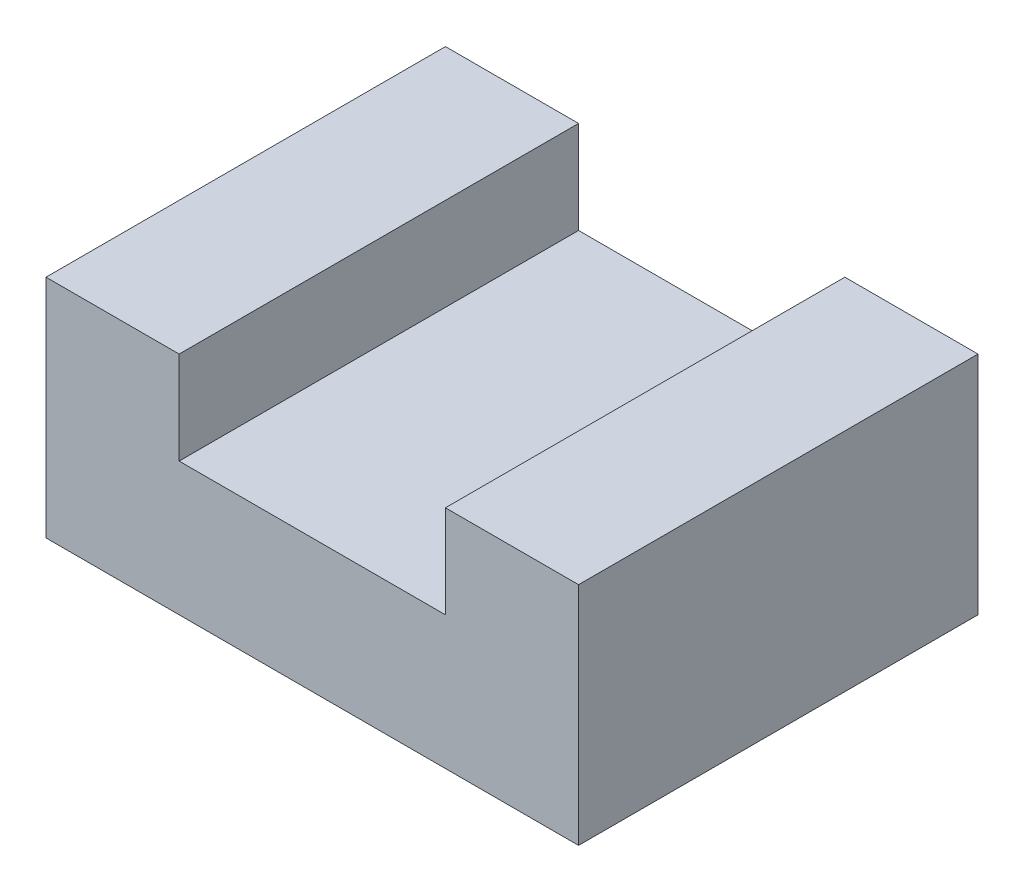
ISO-10303-21;
HEADER;
FILE_DESCRIPTION(('STEP AP214'),'2;1');
FILE_NAME('part.step','',(''),(''),'','','');
FILE_SCHEMA(('AUTOMOTIVE_DESIGN { 1 0 10303 214 1 1 1 1 }'));
ENDSEC;
DATA;
#1=APPLICATION_CONTEXT('core data for automotive mechanical design processes');
#2=APPLICATION_PROTOCOL_DEFINITION('international standard','automotive_design',2000,#1);
#3=PRODUCT_CONTEXT('',#1,'mechanical');
#4=PRODUCT('Part','Part','',(#3));
#5=PRODUCT_RELATED_PRODUCT_CATEGORY('part','',(#4));
#6=PRODUCT_DEFINITION_FORMATION('','',#4);
#7=PRODUCT_DEFINITION_CONTEXT('part definition',#1,'design');
#8=PRODUCT_DEFINITION('design','',#6,#7);
#9=PRODUCT_DEFINITION_SHAPE('','',#8);
#10=(LENGTH_UNIT() NAMED_UNIT(*) SI_UNIT(.MILLI.,.METRE.));
#11=(NAMED_UNIT(*) PLANE_ANGLE_UNIT() SI_UNIT($,.RADIAN.));
#12=(NAMED_UNIT(*) SI_UNIT($,.STERADIAN.) SOLID_ANGLE_UNIT());
#13=UNCERTAINTY_MEASURE_WITH_UNIT(LENGTH_MEASURE(1.E-05),#10,'distance_accuracy_value','');
#14=(GEOMETRIC_REPRESENTATION_CONTEXT(3) GLOBAL_UNCERTAINTY_ASSIGNED_CONTEXT((#13)) GLOBAL_UNIT_ASSIGNED_CONTEXT((#10,
#11,#12)) REPRESENTATION_CONTEXT('',''));
#15=CARTESIAN_POINT('',(0.,0.,0.));
#16=DIRECTION('',(0.,0.,1.));
#17=DIRECTION('',(1.,0.,0.));
#18=AXIS2_PLACEMENT_3D('',#15,#16,#17);
#19=CARTESIAN_POINT('',(0.,5.,0.));
#20=DIRECTION('',(0.,1.,0.));
#21=DIRECTION('',(0.,0.,1.));
#22=AXIS2_PLACEMENT_3D('',#19,#20,#21);
#23=PLANE('',#22);
#24=DIRECTION('',(0.,0.,1.));
#25=VECTOR('',#24,1.);
#26=CARTESIAN_POINT('',(15.,5.,-15.));
#27=LINE('',#26,#25);
#28=CARTESIAN_POINT('',(15.,5.,-15.));
#29=VERTEX_POINT('',#28);
#30=CARTESIAN_POINT('',(15.,5.,0.));
#31=VERTEX_POINT('',#30);
#32=EDGE_CURVE('E117',#29,#31,#27,.T.);
#33=ORIENTED_EDGE('',*,*,#32,.F.);
#34=DIRECTION('',(-1.,0.,0.));
#35=VECTOR('',#34,1.);
#36=CARTESIAN_POINT('',(0.,5.,-15.));
#37=LINE('',#36,#35);
#38=CARTESIAN_POINT('',(5.,5.,-15.));
#39=VERTEX_POINT('',#38);
#40=EDGE_CURVE('E152',#29,#39,#37,.T.);
#41=ORIENTED_EDGE('',*,*,#40,.T.);
#42=DIRECTION('',(0.,0.,1.));
#43=VECTOR('',#42,1.);
#44=CARTESIAN_POINT('',(5.,5.,-15.));
#45=LINE('',#44,#43);
#46=CARTESIAN_POINT('',(5.,5.,0.));
#47=VERTEX_POINT('',#46);
#48=EDGE_CURVE('E140',#39,#47,#45,.T.);
#49=ORIENTED_EDGE('',*,*,#48,.T.);
#50=DIRECTION('',(1.,0.,0.));
#51=VECTOR('',#50,1.);
#52=CARTESIAN_POINT('',(0.,5.,0.));
#53=LINE('',#52,#51);
#54=EDGE_CURVE('E53',#47,#31,#53,.T.);
#55=ORIENTED_EDGE('',*,*,#54,.T.);
#56=EDGE_LOOP('',(#33,#41,#49,#55));
#57=FACE_BOUND('',#56,.T.);
#58=ADVANCED_FACE('F38',(#57),#23,.T.);
#59=CARTESIAN_POINT('',(0.,5.,-15.));
#60=DIRECTION('',(1.,0.,0.));
#61=DIRECTION('',(0.,0.,-1.));
#62=AXIS2_PLACEMENT_3D('',#59,#60,#61);
#63=PLANE('',#62);
#64=DIRECTION('',(0.,0.,1.));
#65=VECTOR('',#64,1.);
#66=CARTESIAN_POINT('',(0.,0.,-15.));
#67=LINE('',#66,#65);
#68=CARTESIAN_POINT('',(0.,0.,-15.));
#69=VERTEX_POINT('',#68);
#70=CARTESIAN_POINT('',(0.,0.,0.));
#71=VERTEX_POINT('',#70);
#72=EDGE_CURVE('E147',#69,#71,#67,.T.);
#73=ORIENTED_EDGE('',*,*,#72,.T.);
#74=DIRECTION('',(0.,-1.,0.));
#75=VECTOR('',#74,1.);
#76=CARTESIAN_POINT('',(0.,5.,0.));
#77=LINE('',#76,#75);
#78=CARTESIAN_POINT('',(0.,8.48081190112053,0.));
#79=VERTEX_POINT('',#78);
#80=EDGE_CURVE('E11',#79,#71,#77,.T.);
#81=ORIENTED_EDGE('',*,*,#80,.F.);
#82=DIRECTION('',(0.,0.,1.));
#83=VECTOR('',#82,1.);
#84=CARTESIAN_POINT('',(0.,8.48081190112053,-15.));
#85=LINE('',#84,#83);
#86=CARTESIAN_POINT('',(0.,8.48081190112053,-15.));
#87=VERTEX_POINT('',#86);
#88=EDGE_CURVE('E144',#87,#79,#85,.T.);
#89=ORIENTED_EDGE('',*,*,#88,.F.);
#90=DIRECTION('',(0.,-1.,0.));
#91=VECTOR('',#90,1.);
#92=CARTESIAN_POINT('',(0.,5.,-15.));
#93=LINE('',#92,#91);
#94=EDGE_CURVE('E155',#87,#69,#93,.T.);
#95=ORIENTED_EDGE('',*,*,#94,.T.);
#96=EDGE_LOOP('',(#73,#81,#89,#95));
#97=FACE_BOUND('',#96,.T.);
#98=ADVANCED_FACE('F40',(#97),#63,.F.);
#99=CARTESIAN_POINT('',(0.,5.,0.));
#100=DIRECTION('',(0.,0.,-1.));
#101=DIRECTION('',(-1.,0.,0.));
#102=AXIS2_PLACEMENT_3D('',#99,#100,#101);
#103=PLANE('',#102);
#104=DIRECTION('',(1.,0.,0.));
#105=VECTOR('',#104,1.);
#106=CARTESIAN_POINT('',(0.,0.,0.));
#107=LINE('',#106,#105);
#108=CARTESIAN_POINT('',(20.,0.,0.));
#109=VERTEX_POINT('',#108);
#110=EDGE_CURVE('E158',#71,#109,#107,.T.);
#111=ORIENTED_EDGE('',*,*,#110,.T.);
#112=DIRECTION('',(0.,-1.,0.));
#113=VECTOR('',#112,1.);
#114=CARTESIAN_POINT('',(20.,5.,0.));
#115=LINE('',#114,#113);
#116=CARTESIAN_POINT('',(20.,8.48081190112049,0.));
#117=VERTEX_POINT('',#116);
#118=EDGE_CURVE('E46',#117,#109,#115,.T.);
#119=ORIENTED_EDGE('',*,*,#118,.F.);
#120=DIRECTION('',(-1.,0.,0.));
#121=VECTOR('',#120,1.);
#122=CARTESIAN_POINT('',(20.,8.48081190112049,0.));
#123=LINE('',#122,#121);
#124=CARTESIAN_POINT('',(15.,8.48081190112048,0.));
#125=VERTEX_POINT('',#124);
#126=EDGE_CURVE('E110',#117,#125,#123,.T.);
#127=ORIENTED_EDGE('',*,*,#126,.T.);
#128=DIRECTION('',(0.,-1.,0.));
#129=VECTOR('',#128,1.);
#130=CARTESIAN_POINT('',(15.,5.,0.));
#131=LINE('',#130,#129);
#132=EDGE_CURVE('E120',#125,#31,#131,.T.);
#133=ORIENTED_EDGE('',*,*,#132,.T.);
#134=ORIENTED_EDGE('',*,*,#54,.F.);
#135=DIRECTION('',(0.,1.,0.));
#136=VECTOR('',#135,1.);
#137=CARTESIAN_POINT('',(5.,5.,0.));
#138=LINE('',#137,#136);
#139=CARTESIAN_POINT('',(5.,8.48081190112053,0.));
#140=VERTEX_POINT('',#139);
#141=EDGE_CURVE('E61',#47,#140,#138,.T.);
#142=ORIENTED_EDGE('',*,*,#141,.T.);
#143=DIRECTION('',(-1.,0.,0.));
#144=VECTOR('',#143,1.);
#145=CARTESIAN_POINT('',(0.,8.48081190112053,0.));
#146=LINE('',#145,#144);
#147=EDGE_CURVE('E128',#140,#79,#146,.T.);
#148=ORIENTED_EDGE('',*,*,#147,.T.);
#149=ORIENTED_EDGE('',*,*,#80,.T.);
#150=EDGE_LOOP('',(#111,#119,#127,#133,#134,#142,#148,#149));
#151=FACE_BOUND('',#150,.T.);
#152=ADVANCED_FACE('F124',(#151),#103,.F.);
#153=CARTESIAN_POINT('',(20.,5.,-15.));
#154=DIRECTION('',(-1.,0.,0.));
#155=DIRECTION('',(0.,0.,1.));
#156=AXIS2_PLACEMENT_3D('',#153,#154,#155);
#157=PLANE('',#156);
#158=DIRECTION('',(0.,0.,-1.));
#159=VECTOR('',#158,1.);
#160=CARTESIAN_POINT('',(20.,0.,-15.));
#161=LINE('',#160,#159);
#162=CARTESIAN_POINT('',(20.,0.,-15.));
#163=VERTEX_POINT('',#162);
#164=EDGE_CURVE('E160',#109,#163,#161,.T.);
#165=ORIENTED_EDGE('',*,*,#164,.T.);
#166=DIRECTION('',(0.,-1.,0.));
#167=VECTOR('',#166,1.);
#168=CARTESIAN_POINT('',(20.,5.,-15.));
#169=LINE('',#168,#167);
#170=CARTESIAN_POINT('',(20.,8.48081190112049,-15.));
#171=VERTEX_POINT('',#170);
#172=EDGE_CURVE('E165',#171,#163,#169,.T.);
#173=ORIENTED_EDGE('',*,*,#172,.F.);
#174=DIRECTION('',(0.,0.,1.));
#175=VECTOR('',#174,1.);
#176=CARTESIAN_POINT('',(20.,8.48081190112049,-15.));
#177=LINE('',#176,#175);
#178=EDGE_CURVE('E116',#171,#117,#177,.T.);
#179=ORIENTED_EDGE('',*,*,#178,.T.);
#180=ORIENTED_EDGE('',*,*,#118,.T.);
#181=EDGE_LOOP('',(#165,#173,#179,#180));
#182=FACE_BOUND('',#181,.T.);
#183=ADVANCED_FACE('F169',(#182),#157,.F.);
#184=CARTESIAN_POINT('',(0.,5.,-15.));
#185=DIRECTION('',(0.,0.,1.));
#186=DIRECTION('',(1.,0.,0.));
#187=AXIS2_PLACEMENT_3D('',#184,#185,#186);
#188=PLANE('',#187);
#189=DIRECTION('',(-1.,0.,0.));
#190=VECTOR('',#189,1.);
#191=CARTESIAN_POINT('',(0.,0.,-15.));
#192=LINE('',#191,#190);
#193=EDGE_CURVE('E153',#163,#69,#192,.T.);
#194=ORIENTED_EDGE('',*,*,#193,.T.);
#195=ORIENTED_EDGE('',*,*,#94,.F.);
#196=DIRECTION('',(-1.,0.,0.));
#197=VECTOR('',#196,1.);
#198=CARTESIAN_POINT('',(0.,8.48081190112053,-15.));
#199=LINE('',#198,#197);
#200=CARTESIAN_POINT('',(5.,8.48081190112053,-15.));
#201=VERTEX_POINT('',#200);
#202=EDGE_CURVE('E138',#201,#87,#199,.T.);
#203=ORIENTED_EDGE('',*,*,#202,.F.);
#204=DIRECTION('',(0.,1.,0.));
#205=VECTOR('',#204,1.);
#206=CARTESIAN_POINT('',(5.,5.,-15.));
#207=LINE('',#206,#205);
#208=EDGE_CURVE('E135',#39,#201,#207,.T.);
#209=ORIENTED_EDGE('',*,*,#208,.F.);
#210=ORIENTED_EDGE('',*,*,#40,.F.);
#211=DIRECTION('',(0.,-1.,0.));
#212=VECTOR('',#211,1.);
#213=CARTESIAN_POINT('',(15.,5.,-15.));
#214=LINE('',#213,#212);
#215=CARTESIAN_POINT('',(15.,8.48081190112048,-15.));
#216=VERTEX_POINT('',#215);
#217=EDGE_CURVE('E132',#216,#29,#214,.T.);
#218=ORIENTED_EDGE('',*,*,#217,.F.);
#219=DIRECTION('',(-1.,0.,0.));
#220=VECTOR('',#219,1.);
#221=CARTESIAN_POINT('',(20.,8.48081190112049,-15.));
#222=LINE('',#221,#220);
#223=EDGE_CURVE('E112',#171,#216,#222,.T.);
#224=ORIENTED_EDGE('',*,*,#223,.F.);
#225=ORIENTED_EDGE('',*,*,#172,.T.);
#226=EDGE_LOOP('',(#194,#195,#203,#209,#210,#218,#224,#225));
#227=FACE_BOUND('',#226,.T.);
#228=ADVANCED_FACE('F175',(#227),#188,.F.);
#229=CARTESIAN_POINT('',(0.,0.,0.));
#230=DIRECTION('',(0.,1.,0.));
#231=DIRECTION('',(0.,0.,1.));
#232=AXIS2_PLACEMENT_3D('',#229,#230,#231);
#233=PLANE('',#232);
#234=ORIENTED_EDGE('',*,*,#72,.F.);
#235=ORIENTED_EDGE('',*,*,#193,.F.);
#236=ORIENTED_EDGE('',*,*,#164,.F.);
#237=ORIENTED_EDGE('',*,*,#110,.F.);
#238=EDGE_LOOP('',(#234,#235,#236,#237));
#239=FACE_BOUND('',#238,.T.);
#240=ADVANCED_FACE('F173',(#239),#233,.F.);
#241=CARTESIAN_POINT('',(0.,8.48081190112053,-15.));
#242=DIRECTION('',(0.,1.,0.));
#243=DIRECTION('',(0.,0.,1.));
#244=AXIS2_PLACEMENT_3D('',#241,#242,#243);
#245=PLANE('',#244);
#246=ORIENTED_EDGE('',*,*,#147,.F.);
#247=DIRECTION('',(0.,0.,1.));
#248=VECTOR('',#247,1.);
#249=CARTESIAN_POINT('',(5.,8.48081190112053,-15.));
#250=LINE('',#249,#248);
#251=EDGE_CURVE('E148',#201,#140,#250,.T.);
#252=ORIENTED_EDGE('',*,*,#251,.F.);
#253=ORIENTED_EDGE('',*,*,#202,.T.);
#254=ORIENTED_EDGE('',*,*,#88,.T.);
#255=EDGE_LOOP('',(#246,#252,#253,#254));
#256=FACE_BOUND('',#255,.T.);
#257=ADVANCED_FACE('F181',(#256),#245,.T.);
#258=CARTESIAN_POINT('',(5.,5.,-15.));
#259=DIRECTION('',(1.,0.,0.));
#260=DIRECTION('',(0.,0.,-1.));
#261=AXIS2_PLACEMENT_3D('',#258,#259,#260);
#262=PLANE('',#261);
#263=ORIENTED_EDGE('',*,*,#141,.F.);
#264=ORIENTED_EDGE('',*,*,#48,.F.);
#265=ORIENTED_EDGE('',*,*,#208,.T.);
#266=ORIENTED_EDGE('',*,*,#251,.T.);
#267=EDGE_LOOP('',(#263,#264,#265,#266));
#268=FACE_BOUND('',#267,.T.);
#269=ADVANCED_FACE('F183',(#268),#262,.T.);
#270=CARTESIAN_POINT('',(15.,5.,-15.));
#271=DIRECTION('',(-1.,0.,0.));
#272=DIRECTION('',(0.,0.,1.));
#273=AXIS2_PLACEMENT_3D('',#270,#271,#272);
#274=PLANE('',#273);
#275=ORIENTED_EDGE('',*,*,#132,.F.);
#276=DIRECTION('',(0.,0.,1.));
#277=VECTOR('',#276,1.);
#278=CARTESIAN_POINT('',(15.,8.48081190112048,-15.));
#279=LINE('',#278,#277);
#280=EDGE_CURVE('E105',#216,#125,#279,.T.);
#281=ORIENTED_EDGE('',*,*,#280,.F.);
#282=ORIENTED_EDGE('',*,*,#217,.T.);
#283=ORIENTED_EDGE('',*,*,#32,.T.);
#284=EDGE_LOOP('',(#275,#281,#282,#283));
#285=FACE_BOUND('',#284,.T.);
#286=ADVANCED_FACE('F121',(#285),#274,.T.);
#287=CARTESIAN_POINT('',(20.,8.48081190112049,-15.));
#288=DIRECTION('',(0.,1.,0.));
#289=DIRECTION('',(-1.,0.,0.));
#290=AXIS2_PLACEMENT_3D('',#287,#288,#289);
#291=PLANE('',#290);
#292=ORIENTED_EDGE('',*,*,#126,.F.);
#293=ORIENTED_EDGE('',*,*,#178,.F.);
#294=ORIENTED_EDGE('',*,*,#223,.T.);
#295=ORIENTED_EDGE('',*,*,#280,.T.);
#296=EDGE_LOOP('',(#292,#293,#294,#295));
#297=FACE_BOUND('',#296,.T.);
#298=ADVANCED_FACE('F107',(#297),#291,.T.);
#299=CLOSED_SHELL('',(#58,#98,#152,#183,#228,#240,#257,#269,#286,#298));
#300=MANIFOLD_SOLID_BREP('B2',#299);
#301=ADVANCED_BREP_SHAPE_REPRESENTATION('',(#18,#300),#14);
#302=SHAPE_DEFINITION_REPRESENTATION(#9,#301);
ENDSEC;
END-ISO-10303-21;
